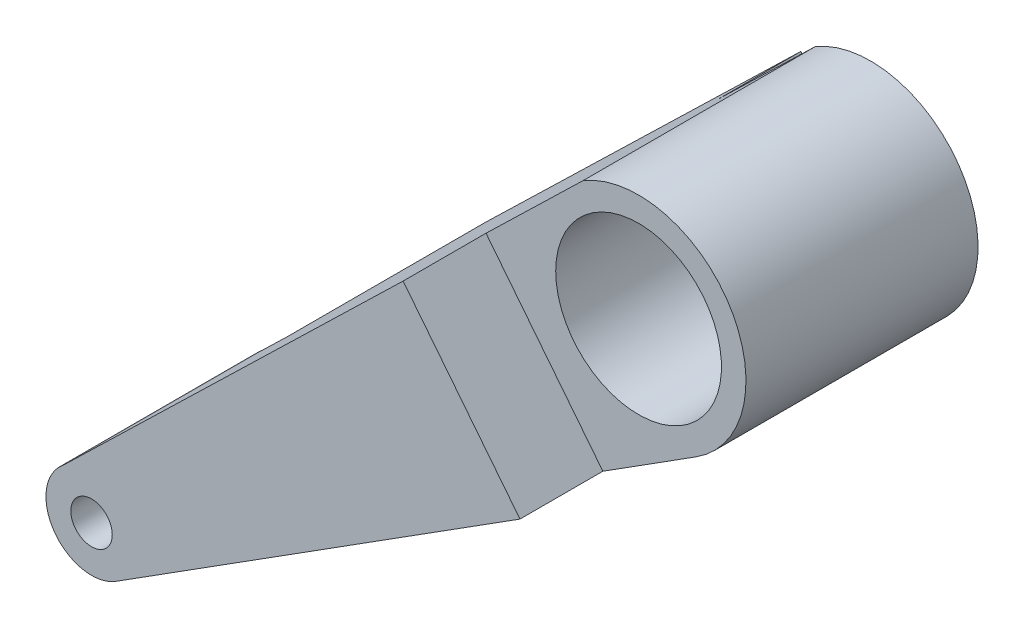
ISO-10303-21;
HEADER;
FILE_DESCRIPTION(('STEP AP214'),'2;1');
FILE_NAME('part.step','',(''),(''),'','','');
FILE_SCHEMA(('AUTOMOTIVE_DESIGN { 1 0 10303 214 1 1 1 1 }'));
ENDSEC;
DATA;
#1=APPLICATION_CONTEXT('core data for automotive mechanical design processes');
#2=APPLICATION_PROTOCOL_DEFINITION('international standard','automotive_design',2000,#1);
#3=PRODUCT_CONTEXT('',#1,'mechanical');
#4=PRODUCT('Part','Part','',(#3));
#5=PRODUCT_RELATED_PRODUCT_CATEGORY('part','',(#4));
#6=PRODUCT_DEFINITION_FORMATION('','',#4);
#7=PRODUCT_DEFINITION_CONTEXT('part definition',#1,'design');
#8=PRODUCT_DEFINITION('design','',#6,#7);
#9=PRODUCT_DEFINITION_SHAPE('','',#8);
#10=(LENGTH_UNIT() NAMED_UNIT(*) SI_UNIT(.MILLI.,.METRE.));
#11=(NAMED_UNIT(*) PLANE_ANGLE_UNIT() SI_UNIT($,.RADIAN.));
#12=(NAMED_UNIT(*) SI_UNIT($,.STERADIAN.) SOLID_ANGLE_UNIT());
#13=UNCERTAINTY_MEASURE_WITH_UNIT(LENGTH_MEASURE(1.E-05),#10,'distance_accuracy_value','');
#14=(GEOMETRIC_REPRESENTATION_CONTEXT(3) GLOBAL_UNCERTAINTY_ASSIGNED_CONTEXT((#13)) GLOBAL_UNIT_ASSIGNED_CONTEXT((#10,
#11,#12)) REPRESENTATION_CONTEXT('',''));
#15=CARTESIAN_POINT('',(0.,0.,0.));
#16=DIRECTION('',(0.,0.,1.));
#17=DIRECTION('',(1.,0.,0.));
#18=AXIS2_PLACEMENT_3D('',#15,#16,#17);
#19=CARTESIAN_POINT('',(0.,0.,0.));
#20=DIRECTION('',(0.,0.,1.));
#21=DIRECTION('',(1.,0.,0.));
#22=AXIS2_PLACEMENT_3D('',#19,#20,#21);
#23=PLANE('',#22);
#24=DIRECTION('',(0.620415929911475,-0.784272958804573,0.));
#25=VECTOR('',#24,1.);
#26=CARTESIAN_POINT('',(-74.8547227455093,-35.0390369146901,0.));
#27=LINE('',#26,#25);
#28=CARTESIAN_POINT('',(-69.1018517159101,-42.3112892320165,0.));
#29=VERTEX_POINT('',#28);
#30=CARTESIAN_POINT('',(-65.5770626378652,-46.7670045451207,0.));
#31=VERTEX_POINT('',#30);
#32=EDGE_CURVE('E146',#29,#31,#27,.T.);
#33=ORIENTED_EDGE('',*,*,#32,.T.);
#34=DIRECTION('',(-0.844786616874065,-0.535103328293211,0.));
#35=VECTOR('',#34,1.);
#36=CARTESIAN_POINT('',(2.3638912311712,-3.7319589885734,0.));
#37=LINE('',#36,#35);
#38=CARTESIAN_POINT('',(-76.7736328082284,-53.8591173271618,0.));
#39=VERTEX_POINT('',#38);
#40=EDGE_CURVE('E217',#31,#39,#37,.T.);
#41=ORIENTED_EDGE('',*,*,#40,.T.);
#42=CARTESIAN_POINT('',(-76.9074086403016,-53.6479206729432,0.));
#43=DIRECTION('',(0.,0.,-1.));
#44=DIRECTION('',(-1.,0.,0.));
#45=AXIS2_PLACEMENT_3D('',#42,#43,#44);
#46=CIRCLE('',#45,0.249999999999998);
#47=CARTESIAN_POINT('',(-77.1524226956398,-53.5982405694135,0.));
#48=VERTEX_POINT('',#47);
#49=EDGE_CURVE('E187',#39,#48,#46,.T.);
#50=ORIENTED_EDGE('',*,*,#49,.T.);
#51=CARTESIAN_POINT('',(-78.5,-53.325,0.));
#52=DIRECTION('',(0.,0.,1.));
#53=DIRECTION('',(1.,0.,0.));
#54=AXIS2_PLACEMENT_3D('',#51,#52,#53);
#55=CIRCLE('',#54,1.375);
#56=CARTESIAN_POINT('',(-78.4423621116321,-51.9512085770305,0.));
#57=VERTEX_POINT('',#56);
#58=EDGE_CURVE('E201',#57,#48,#55,.F.);
#59=ORIENTED_EDGE('',*,*,#58,.F.);
#60=CARTESIAN_POINT('',(-78.4318824955652,-51.7014283183088,0.));
#61=DIRECTION('',(0.,0.,-1.));
#62=DIRECTION('',(-1.,0.,0.));
#63=AXIS2_PLACEMENT_3D('',#60,#61,#62);
#64=CIRCLE('',#63,0.25);
#65=CARTESIAN_POINT('',(-78.6058663648903,-51.5219022388254,0.));
#66=VERTEX_POINT('',#65);
#67=EDGE_CURVE('E173',#57,#66,#64,.T.);
#68=ORIENTED_EDGE('',*,*,#67,.T.);
#69=DIRECTION('',(-0.718104317933688,-0.695935477300154,0.));
#70=VECTOR('',#69,1.);
#71=CARTESIAN_POINT('',(-12.3225889484507,12.7151217614788,0.));
#72=LINE('',#71,#70);
#73=EDGE_CURVE('E215',#29,#66,#72,.T.);
#74=ORIENTED_EDGE('',*,*,#73,.F.);
#75=EDGE_LOOP('',(#33,#41,#50,#59,#68,#74));
#76=FACE_BOUND('',#75,.T.);
#77=ADVANCED_FACE('F42',(#76),#23,.F.);
#78=CARTESIAN_POINT('',(-64.5,-42.25,36.3447015338897));
#79=DIRECTION('',(0.,0.,-1.));
#80=DIRECTION('',(-1.,0.,0.));
#81=AXIS2_PLACEMENT_3D('',#78,#79,#80);
#82=CYLINDRICAL_SURFACE('',#81,3.23956518577534);
#83=CARTESIAN_POINT('',(-64.5,-42.25,2.5));
#84=DIRECTION('',(0.,0.,-1.));
#85=DIRECTION('',(-1.,0.,0.));
#86=AXIS2_PLACEMENT_3D('',#83,#84,#85);
#87=CIRCLE('',#86,3.23956518577534);
#88=CARTESIAN_POINT('',(-66.1812542368595,-39.4808545029325,2.5));
#89=VERTEX_POINT('',#88);
#90=CARTESIAN_POINT('',(-62.7664978868688,-44.9867413134342,2.5));
#91=VERTEX_POINT('',#90);
#92=EDGE_CURVE('E164',#89,#91,#87,.T.);
#93=ORIENTED_EDGE('',*,*,#92,.F.);
#94=DIRECTION('',(0.,0.,-1.));
#95=VECTOR('',#94,1.);
#96=CARTESIAN_POINT('',(-66.1812542368595,-39.4808545029325,36.3447015338897));
#97=LINE('',#96,#95);
#98=CARTESIAN_POINT('',(-66.1812542368595,-39.4808545029325,9.50000000000001));
#99=VERTEX_POINT('',#98);
#100=EDGE_CURVE('E219',#99,#89,#97,.T.);
#101=ORIENTED_EDGE('',*,*,#100,.F.);
#102=CARTESIAN_POINT('',(-64.5,-42.25,9.50000000000001));
#103=DIRECTION('',(0.,0.,-1.));
#104=DIRECTION('',(-1.,0.,0.));
#105=AXIS2_PLACEMENT_3D('',#102,#103,#104);
#106=CIRCLE('',#105,3.23956518577534);
#107=CARTESIAN_POINT('',(-62.7664978868688,-44.9867413134342,9.50000000000001));
#108=VERTEX_POINT('',#107);
#109=EDGE_CURVE('E137',#99,#108,#106,.T.);
#110=ORIENTED_EDGE('',*,*,#109,.T.);
#111=DIRECTION('',(0.,0.,-1.));
#112=VECTOR('',#111,1.);
#113=CARTESIAN_POINT('',(-62.7664978868688,-44.9867413134342,36.3447015338897));
#114=LINE('',#113,#112);
#115=EDGE_CURVE('E221',#108,#91,#114,.T.);
#116=ORIENTED_EDGE('',*,*,#115,.T.);
#117=EDGE_LOOP('',(#93,#101,#110,#116));
#118=FACE_BOUND('',#117,.T.);
#119=ADVANCED_FACE('F250',(#118),#82,.T.);
#120=CARTESIAN_POINT('',(2.3638912311712,-3.7319589885734,36.3447015338897));
#121=DIRECTION('',(0.535103328293211,-0.844786616874065,0.));
#122=DIRECTION('',(0.844786616874065,0.535103328293211,0.));
#123=AXIS2_PLACEMENT_3D('',#120,#121,#122);
#124=PLANE('',#123);
#125=ORIENTED_EDGE('',*,*,#40,.F.);
#126=DIRECTION('',(0.,0.,1.));
#127=VECTOR('',#126,1.);
#128=CARTESIAN_POINT('',(-65.5770626378649,-46.7670045451205,36.3447015338904));
#129=LINE('',#128,#127);
#130=CARTESIAN_POINT('',(-65.5770626378652,-46.7670045451207,2.5));
#131=VERTEX_POINT('',#130);
#132=EDGE_CURVE('E169',#31,#131,#129,.T.);
#133=ORIENTED_EDGE('',*,*,#132,.T.);
#134=DIRECTION('',(0.844786616874065,0.535103328293211,0.));
#135=VECTOR('',#134,1.);
#136=CARTESIAN_POINT('',(2.3638912311712,-3.7319589885734,2.5));
#137=LINE('',#136,#135);
#138=EDGE_CURVE('E166',#131,#91,#137,.T.);
#139=ORIENTED_EDGE('',*,*,#138,.T.);
#140=ORIENTED_EDGE('',*,*,#115,.F.);
#141=DIRECTION('',(0.844786616874065,0.535103328293211,0.));
#142=VECTOR('',#141,1.);
#143=CARTESIAN_POINT('',(2.3638912311712,-3.7319589885734,9.50000000000001));
#144=LINE('',#143,#142);
#145=CARTESIAN_POINT('',(-65.5770626378652,-46.7670045451207,9.50000000000001));
#146=VERTEX_POINT('',#145);
#147=EDGE_CURVE('E159',#146,#108,#144,.T.);
#148=ORIENTED_EDGE('',*,*,#147,.F.);
#149=DIRECTION('',(0.,0.,-1.));
#150=VECTOR('',#149,1.);
#151=CARTESIAN_POINT('',(-65.5770626378653,-46.7670045451208,36.3447015338891));
#152=LINE('',#151,#150);
#153=CARTESIAN_POINT('',(-65.5770626378652,-46.7670045451207,12.));
#154=VERTEX_POINT('',#153);
#155=EDGE_CURVE('E145',#154,#146,#152,.T.);
#156=ORIENTED_EDGE('',*,*,#155,.F.);
#157=DIRECTION('',(-0.844786616874065,-0.535103328293211,0.));
#158=VECTOR('',#157,1.);
#159=CARTESIAN_POINT('',(2.3638912311712,-3.7319589885734,12.));
#160=LINE('',#159,#158);
#161=CARTESIAN_POINT('',(-77.7642329235968,-54.4865815982019,12.));
#162=VERTEX_POINT('',#161);
#163=EDGE_CURVE('E209',#154,#162,#160,.T.);
#164=ORIENTED_EDGE('',*,*,#163,.T.);
#165=DIRECTION('',(0.,0.,-1.));
#166=VECTOR('',#165,1.);
#167=CARTESIAN_POINT('',(-77.7642329235968,-54.4865815982019,36.3447015338897));
#168=LINE('',#167,#166);
#169=CARTESIAN_POINT('',(-77.7642329235968,-54.4865815982019,6.00000000000001));
#170=VERTEX_POINT('',#169);
#171=EDGE_CURVE('E224',#162,#170,#168,.T.);
#172=ORIENTED_EDGE('',*,*,#171,.T.);
#173=DIRECTION('',(-0.844786616874065,-0.535103328293211,0.));
#174=VECTOR('',#173,1.);
#175=CARTESIAN_POINT('',(2.3638912311712,-3.7319589885734,6.00000000000001));
#176=LINE('',#175,#174);
#177=CARTESIAN_POINT('',(-76.7736328082284,-53.8591173271618,6.00000000000001));
#178=VERTEX_POINT('',#177);
#179=EDGE_CURVE('E181',#178,#170,#176,.T.);
#180=ORIENTED_EDGE('',*,*,#179,.F.);
#181=DIRECTION('',(0.,0.,-1.));
#182=VECTOR('',#181,1.);
#183=CARTESIAN_POINT('',(-76.7736328082284,-53.8591173271618,8.06049240091175));
#184=LINE('',#183,#182);
#185=EDGE_CURVE('E190',#178,#39,#184,.T.);
#186=ORIENTED_EDGE('',*,*,#185,.T.);
#187=EDGE_LOOP('',(#125,#133,#139,#140,#148,#156,#164,#172,#180,#186));
#188=FACE_BOUND('',#187,.T.);
#189=ADVANCED_FACE('F256',(#188),#124,.T.);
#190=CARTESIAN_POINT('',(-12.3225889484507,12.7151217614788,36.3447015338897));
#191=DIRECTION('',(0.695935477300154,-0.718104317933688,0.));
#192=DIRECTION('',(0.718104317933688,0.695935477300154,0.));
#193=AXIS2_PLACEMENT_3D('',#190,#191,#192);
#194=PLANE('',#193);
#195=DIRECTION('',(0.,0.,1.));
#196=VECTOR('',#195,1.);
#197=CARTESIAN_POINT('',(-69.1018517159099,-42.3112892320163,36.3447015338904));
#198=LINE('',#197,#196);
#199=CARTESIAN_POINT('',(-69.1018517159101,-42.3112892320165,2.5));
#200=VERTEX_POINT('',#199);
#201=EDGE_CURVE('E11',#29,#200,#198,.T.);
#202=ORIENTED_EDGE('',*,*,#201,.F.);
#203=ORIENTED_EDGE('',*,*,#73,.T.);
#204=DIRECTION('',(0.,0.,-1.));
#205=VECTOR('',#204,1.);
#206=CARTESIAN_POINT('',(-78.6058663648903,-51.5219022388254,8.06049240091175));
#207=LINE('',#206,#205);
#208=CARTESIAN_POINT('',(-78.6058663648903,-51.5219022388254,6.00000000000001));
#209=VERTEX_POINT('',#208);
#210=EDGE_CURVE('E176',#209,#66,#207,.T.);
#211=ORIENTED_EDGE('',*,*,#210,.F.);
#212=DIRECTION('',(-0.718104317933688,-0.695935477300154,0.));
#213=VECTOR('',#212,1.);
#214=CARTESIAN_POINT('',(-12.3225889484507,12.7151217614788,6.00000000000001));
#215=LINE('',#214,#213);
#216=CARTESIAN_POINT('',(-79.3563995179238,-52.249265429718,6.00000000000001));
#217=VERTEX_POINT('',#216);
#218=EDGE_CURVE('E198',#209,#217,#215,.T.);
#219=ORIENTED_EDGE('',*,*,#218,.T.);
#220=DIRECTION('',(0.,0.,-1.));
#221=VECTOR('',#220,1.);
#222=CARTESIAN_POINT('',(-79.3563995179238,-52.249265429718,36.3447015338897));
#223=LINE('',#222,#221);
#224=CARTESIAN_POINT('',(-79.3563995179238,-52.249265429718,12.));
#225=VERTEX_POINT('',#224);
#226=EDGE_CURVE('E227',#225,#217,#223,.T.);
#227=ORIENTED_EDGE('',*,*,#226,.F.);
#228=DIRECTION('',(-0.718104317933688,-0.695935477300154,0.));
#229=VECTOR('',#228,1.);
#230=CARTESIAN_POINT('',(-12.3225889484507,12.7151217614788,12.));
#231=LINE('',#230,#229);
#232=CARTESIAN_POINT('',(-69.1018517159101,-42.3112892320165,12.));
#233=VERTEX_POINT('',#232);
#234=EDGE_CURVE('E152',#233,#225,#231,.T.);
#235=ORIENTED_EDGE('',*,*,#234,.F.);
#236=DIRECTION('',(0.,0.,-1.));
#237=VECTOR('',#236,1.);
#238=CARTESIAN_POINT('',(-69.1018517159102,-42.3112892320166,36.3447015338891));
#239=LINE('',#238,#237);
#240=CARTESIAN_POINT('',(-69.1018517159101,-42.3112892320165,9.50000000000001));
#241=VERTEX_POINT('',#240);
#242=EDGE_CURVE('E64',#233,#241,#239,.T.);
#243=ORIENTED_EDGE('',*,*,#242,.T.);
#244=DIRECTION('',(0.718104317933688,0.695935477300154,0.));
#245=VECTOR('',#244,1.);
#246=CARTESIAN_POINT('',(-12.3225889484507,12.7151217614788,9.50000000000001));
#247=LINE('',#246,#245);
#248=EDGE_CURVE('E131',#241,#99,#247,.T.);
#249=ORIENTED_EDGE('',*,*,#248,.T.);
#250=ORIENTED_EDGE('',*,*,#100,.T.);
#251=DIRECTION('',(0.718104317933688,0.695935477300154,0.));
#252=VECTOR('',#251,1.);
#253=CARTESIAN_POINT('',(-12.3225889484507,12.7151217614788,2.5));
#254=LINE('',#253,#252);
#255=EDGE_CURVE('E162',#200,#89,#254,.T.);
#256=ORIENTED_EDGE('',*,*,#255,.F.);
#257=EDGE_LOOP('',(#202,#203,#211,#219,#227,#235,#243,#249,#250,#256));
#258=FACE_BOUND('',#257,.T.);
#259=ADVANCED_FACE('F150',(#258),#194,.F.);
#260=CARTESIAN_POINT('',(-78.5,-53.325,-3.88908729652601));
#261=DIRECTION('',(0.,0.,1.));
#262=DIRECTION('',(1.,0.,0.));
#263=AXIS2_PLACEMENT_3D('',#260,#261,#262);
#264=CYLINDRICAL_SURFACE('',#263,1.375);
#265=CARTESIAN_POINT('',(-78.5,-53.325,6.00000000000001));
#266=DIRECTION('',(0.,0.,1.));
#267=DIRECTION('',(1.,0.,0.));
#268=AXIS2_PLACEMENT_3D('',#265,#266,#267);
#269=CIRCLE('',#268,1.375);
#270=CARTESIAN_POINT('',(-77.1524226956398,-53.5982405694135,6.00000000000001));
#271=VERTEX_POINT('',#270);
#272=CARTESIAN_POINT('',(-78.4423621116321,-51.9512085770305,6.00000000000001));
#273=VERTEX_POINT('',#272);
#274=EDGE_CURVE('E207',#271,#273,#269,.T.);
#275=ORIENTED_EDGE('',*,*,#274,.T.);
#276=DIRECTION('',(0.,0.,-1.));
#277=VECTOR('',#276,1.);
#278=CARTESIAN_POINT('',(-78.4423621116321,-51.9512085770305,8.06049240091175));
#279=LINE('',#278,#277);
#280=EDGE_CURVE('E177',#273,#57,#279,.T.);
#281=ORIENTED_EDGE('',*,*,#280,.T.);
#282=ORIENTED_EDGE('',*,*,#58,.T.);
#283=DIRECTION('',(0.,0.,-1.));
#284=VECTOR('',#283,1.);
#285=CARTESIAN_POINT('',(-77.1524226956398,-53.5982405694135,8.06049240091175));
#286=LINE('',#285,#284);
#287=EDGE_CURVE('E172',#271,#48,#286,.T.);
#288=ORIENTED_EDGE('',*,*,#287,.F.);
#289=EDGE_LOOP('',(#275,#281,#282,#288));
#290=FACE_BOUND('',#289,.T.);
#291=ADVANCED_FACE('F273',(#290),#264,.F.);
#292=CARTESIAN_POINT('',(-78.5,-53.325,36.3447015338897));
#293=DIRECTION('',(0.,0.,-1.));
#294=DIRECTION('',(-1.,0.,0.));
#295=AXIS2_PLACEMENT_3D('',#292,#293,#294);
#296=CYLINDRICAL_SURFACE('',#295,1.375);
#297=ORIENTED_EDGE('',*,*,#226,.T.);
#298=EDGE_CURVE('E204',#217,#170,#269,.T.);
#299=ORIENTED_EDGE('',*,*,#298,.T.);
#300=ORIENTED_EDGE('',*,*,#171,.F.);
#301=CARTESIAN_POINT('',(-78.5,-53.325,12.));
#302=DIRECTION('',(0.,0.,1.));
#303=DIRECTION('',(1.,0.,0.));
#304=AXIS2_PLACEMENT_3D('',#301,#302,#303);
#305=CIRCLE('',#304,1.375);
#306=EDGE_CURVE('E211',#225,#162,#305,.T.);
#307=ORIENTED_EDGE('',*,*,#306,.F.);
#308=EDGE_LOOP('',(#297,#299,#300,#307));
#309=FACE_BOUND('',#308,.T.);
#310=ADVANCED_FACE('F266',(#309),#296,.T.);
#311=CARTESIAN_POINT('',(-78.5,-53.325,36.3447015338897));
#312=DIRECTION('',(0.,0.,-1.));
#313=DIRECTION('',(-1.,0.,0.));
#314=AXIS2_PLACEMENT_3D('',#311,#312,#313);
#315=CYLINDRICAL_SURFACE('',#314,0.625000000000006);
#316=CARTESIAN_POINT('',(-78.5,-53.325,6.00000000000001));
#317=DIRECTION('',(0.,0.,1.));
#318=DIRECTION('',(1.,0.,0.));
#319=AXIS2_PLACEMENT_3D('',#316,#317,#318);
#320=CIRCLE('',#319,0.625000000000006);
#321=CARTESIAN_POINT('',(-77.875,-53.325,6.00000000000001));
#322=VERTEX_POINT('',#321);
#323=EDGE_CURVE('E200',#322,#322,#320,.T.);
#324=ORIENTED_EDGE('',*,*,#323,.F.);
#325=EDGE_LOOP('',(#324));
#326=FACE_BOUND('',#325,.T.);
#327=CARTESIAN_POINT('',(-78.5,-53.325,12.));
#328=DIRECTION('',(0.,0.,1.));
#329=DIRECTION('',(1.,0.,0.));
#330=AXIS2_PLACEMENT_3D('',#327,#328,#329);
#331=CIRCLE('',#330,0.625000000000006);
#332=CARTESIAN_POINT('',(-77.875,-53.325,12.));
#333=VERTEX_POINT('',#332);
#334=EDGE_CURVE('E203',#333,#333,#331,.T.);
#335=ORIENTED_EDGE('',*,*,#334,.T.);
#336=EDGE_LOOP('',(#335));
#337=FACE_BOUND('',#336,.T.);
#338=ADVANCED_FACE('F264',(#326,#337),#315,.F.);
#339=CARTESIAN_POINT('',(0.,-47.,12.));
#340=DIRECTION('',(0.,0.,1.));
#341=DIRECTION('',(1.,0.,0.));
#342=AXIS2_PLACEMENT_3D('',#339,#340,#341);
#343=PLANE('',#342);
#344=DIRECTION('',(0.620415929911475,-0.784272958804573,0.));
#345=VECTOR('',#344,1.);
#346=CARTESIAN_POINT('',(-40.2220369771992,-78.8185042516058,12.));
#347=LINE('',#346,#345);
#348=EDGE_CURVE('E50',#233,#154,#347,.T.);
#349=ORIENTED_EDGE('',*,*,#348,.F.);
#350=ORIENTED_EDGE('',*,*,#234,.T.);
#351=ORIENTED_EDGE('',*,*,#306,.T.);
#352=ORIENTED_EDGE('',*,*,#163,.F.);
#353=EDGE_LOOP('',(#349,#350,#351,#352));
#354=FACE_BOUND('',#353,.T.);
#355=ORIENTED_EDGE('',*,*,#334,.F.);
#356=EDGE_LOOP('',(#355));
#357=FACE_BOUND('',#356,.T.);
#358=ADVANCED_FACE('F262',(#354,#357),#343,.T.);
#359=CARTESIAN_POINT('',(-78.5,-53.325,6.00000000000001));
#360=DIRECTION('',(0.,0.,1.));
#361=DIRECTION('',(1.,0.,0.));
#362=AXIS2_PLACEMENT_3D('',#359,#360,#361);
#363=PLANE('',#362);
#364=CARTESIAN_POINT('',(-78.4318824955652,-51.7014283183088,6.00000000000001));
#365=DIRECTION('',(0.,0.,1.));
#366=DIRECTION('',(1.,0.,0.));
#367=AXIS2_PLACEMENT_3D('',#364,#365,#366);
#368=CIRCLE('',#367,0.25);
#369=EDGE_CURVE('E178',#273,#209,#368,.F.);
#370=ORIENTED_EDGE('',*,*,#369,.F.);
#371=ORIENTED_EDGE('',*,*,#274,.F.);
#372=CARTESIAN_POINT('',(-76.9074086403016,-53.6479206729432,6.00000000000001));
#373=DIRECTION('',(0.,0.,1.));
#374=DIRECTION('',(1.,0.,0.));
#375=AXIS2_PLACEMENT_3D('',#372,#373,#374);
#376=CIRCLE('',#375,0.249999999999998);
#377=EDGE_CURVE('E186',#178,#271,#376,.F.);
#378=ORIENTED_EDGE('',*,*,#377,.F.);
#379=ORIENTED_EDGE('',*,*,#179,.T.);
#380=ORIENTED_EDGE('',*,*,#298,.F.);
#381=ORIENTED_EDGE('',*,*,#218,.F.);
#382=EDGE_LOOP('',(#370,#371,#378,#379,#380,#381));
#383=FACE_BOUND('',#382,.T.);
#384=ORIENTED_EDGE('',*,*,#323,.T.);
#385=EDGE_LOOP('',(#384));
#386=FACE_BOUND('',#385,.T.);
#387=ADVANCED_FACE('F283',(#383,#386),#363,.F.);
#388=CARTESIAN_POINT('',(-76.9074086403016,-53.6479206729432,8.06049240091175));
#389=DIRECTION('',(0.,0.,-1.));
#390=DIRECTION('',(-1.,0.,0.));
#391=AXIS2_PLACEMENT_3D('',#388,#389,#390);
#392=CYLINDRICAL_SURFACE('',#391,0.249999999999998);
#393=ORIENTED_EDGE('',*,*,#377,.T.);
#394=ORIENTED_EDGE('',*,*,#287,.T.);
#395=ORIENTED_EDGE('',*,*,#49,.F.);
#396=ORIENTED_EDGE('',*,*,#185,.F.);
#397=EDGE_LOOP('',(#393,#394,#395,#396));
#398=FACE_BOUND('',#397,.T.);
#399=ADVANCED_FACE('F286',(#398),#392,.T.);
#400=CARTESIAN_POINT('',(-78.4318824955652,-51.7014283183088,8.06049240091175));
#401=DIRECTION('',(0.,0.,-1.));
#402=DIRECTION('',(-1.,0.,0.));
#403=AXIS2_PLACEMENT_3D('',#400,#401,#402);
#404=CYLINDRICAL_SURFACE('',#403,0.25);
#405=ORIENTED_EDGE('',*,*,#369,.T.);
#406=ORIENTED_EDGE('',*,*,#210,.T.);
#407=ORIENTED_EDGE('',*,*,#67,.F.);
#408=ORIENTED_EDGE('',*,*,#280,.F.);
#409=EDGE_LOOP('',(#405,#406,#407,#408));
#410=FACE_BOUND('',#409,.T.);
#411=ADVANCED_FACE('F290',(#410),#404,.T.);
#412=CARTESIAN_POINT('',(-11.7636402273755,14.870515863048,9.50000000000001));
#413=DIRECTION('',(0.,0.,-1.));
#414=DIRECTION('',(-1.,0.,0.));
#415=AXIS2_PLACEMENT_3D('',#412,#413,#414);
#416=PLANE('',#415);
#417=ORIENTED_EDGE('',*,*,#147,.T.);
#418=ORIENTED_EDGE('',*,*,#109,.F.);
#419=ORIENTED_EDGE('',*,*,#248,.F.);
#420=DIRECTION('',(0.620415929911475,-0.784272958804573,0.));
#421=VECTOR('',#420,1.);
#422=CARTESIAN_POINT('',(-74.8547227455093,-35.0390369146901,9.50000000000001));
#423=LINE('',#422,#421);
#424=EDGE_CURVE('E134',#241,#146,#423,.T.);
#425=ORIENTED_EDGE('',*,*,#424,.T.);
#426=EDGE_LOOP('',(#417,#418,#419,#425));
#427=FACE_BOUND('',#426,.T.);
#428=CARTESIAN_POINT('',(-64.5,-42.25,9.50000000000001));
#429=DIRECTION('',(0.,0.,-1.));
#430=DIRECTION('',(-1.,0.,0.));
#431=AXIS2_PLACEMENT_3D('',#428,#429,#430);
#432=CIRCLE('',#431,2.5);
#433=CARTESIAN_POINT('',(-67.,-42.25,9.50000000000001));
#434=VERTEX_POINT('',#433);
#435=EDGE_CURVE('E141',#434,#434,#432,.F.);
#436=ORIENTED_EDGE('',*,*,#435,.F.);
#437=EDGE_LOOP('',(#436));
#438=FACE_BOUND('',#437,.T.);
#439=ADVANCED_FACE('F132',(#427,#438),#416,.F.);
#440=CARTESIAN_POINT('',(-74.8547227455093,-35.0390369146901,-6.27470529816604E-13));
#441=DIRECTION('',(-0.784272958804573,-0.620415929911475,0.));
#442=DIRECTION('',(0.620415929911475,-0.784272958804573,0.));
#443=AXIS2_PLACEMENT_3D('',#440,#441,#442);
#444=PLANE('',#443);
#445=ORIENTED_EDGE('',*,*,#155,.T.);
#446=ORIENTED_EDGE('',*,*,#424,.F.);
#447=ORIENTED_EDGE('',*,*,#242,.F.);
#448=ORIENTED_EDGE('',*,*,#348,.T.);
#449=EDGE_LOOP('',(#445,#446,#447,#448));
#450=FACE_BOUND('',#449,.T.);
#451=ADVANCED_FACE('F143',(#450),#444,.F.);
#452=CARTESIAN_POINT('',(-64.5,-42.25,36.3447015338897));
#453=DIRECTION('',(0.,0.,-1.));
#454=DIRECTION('',(-1.,0.,0.));
#455=AXIS2_PLACEMENT_3D('',#452,#453,#454);
#456=CYLINDRICAL_SURFACE('',#455,2.5);
#457=ORIENTED_EDGE('',*,*,#435,.T.);
#458=EDGE_LOOP('',(#457));
#459=FACE_BOUND('',#458,.T.);
#460=CARTESIAN_POINT('',(-64.5,-42.25,2.5));
#461=DIRECTION('',(0.,0.,-1.));
#462=DIRECTION('',(-1.,0.,0.));
#463=AXIS2_PLACEMENT_3D('',#460,#461,#462);
#464=CIRCLE('',#463,2.5);
#465=CARTESIAN_POINT('',(-67.,-42.25,2.5));
#466=VERTEX_POINT('',#465);
#467=EDGE_CURVE('E161',#466,#466,#464,.F.);
#468=ORIENTED_EDGE('',*,*,#467,.F.);
#469=EDGE_LOOP('',(#468));
#470=FACE_BOUND('',#469,.T.);
#471=ADVANCED_FACE('F44',(#459,#470),#456,.F.);
#472=CARTESIAN_POINT('',(-74.8547227455093,-35.0390369146901,6.2708854121087E-13));
#473=DIRECTION('',(0.784272958804573,0.620415929911475,0.));
#474=DIRECTION('',(-0.620415929911475,0.784272958804573,0.));
#475=AXIS2_PLACEMENT_3D('',#472,#473,#474);
#476=PLANE('',#475);
#477=ORIENTED_EDGE('',*,*,#32,.F.);
#478=ORIENTED_EDGE('',*,*,#201,.T.);
#479=DIRECTION('',(0.620415929911475,-0.784272958804573,0.));
#480=VECTOR('',#479,1.);
#481=CARTESIAN_POINT('',(-74.8547227455093,-35.0390369146901,2.5));
#482=LINE('',#481,#480);
#483=EDGE_CURVE('E57',#200,#131,#482,.T.);
#484=ORIENTED_EDGE('',*,*,#483,.T.);
#485=ORIENTED_EDGE('',*,*,#132,.F.);
#486=EDGE_LOOP('',(#477,#478,#484,#485));
#487=FACE_BOUND('',#486,.T.);
#488=ADVANCED_FACE('F240',(#487),#476,.T.);
#489=CARTESIAN_POINT('',(-11.7636402273755,14.870515863048,2.5));
#490=DIRECTION('',(0.,0.,-1.));
#491=DIRECTION('',(-1.,0.,0.));
#492=AXIS2_PLACEMENT_3D('',#489,#490,#491);
#493=PLANE('',#492);
#494=ORIENTED_EDGE('',*,*,#483,.F.);
#495=ORIENTED_EDGE('',*,*,#255,.T.);
#496=ORIENTED_EDGE('',*,*,#92,.T.);
#497=ORIENTED_EDGE('',*,*,#138,.F.);
#498=EDGE_LOOP('',(#494,#495,#496,#497));
#499=FACE_BOUND('',#498,.T.);
#500=ORIENTED_EDGE('',*,*,#467,.T.);
#501=EDGE_LOOP('',(#500));
#502=FACE_BOUND('',#501,.T.);
#503=ADVANCED_FACE('F237',(#499,#502),#493,.T.);
#504=CLOSED_SHELL('',(#77,#119,#189,#259,#291,#310,#338,#358,#387,#399,#411,#439,#451,#471,#488,#503));
#505=MANIFOLD_SOLID_BREP('B2',#504);
#506=ADVANCED_BREP_SHAPE_REPRESENTATION('',(#18,#505),#14);
#507=SHAPE_DEFINITION_REPRESENTATION(#9,#506);
ENDSEC;
END-ISO-10303-21;
